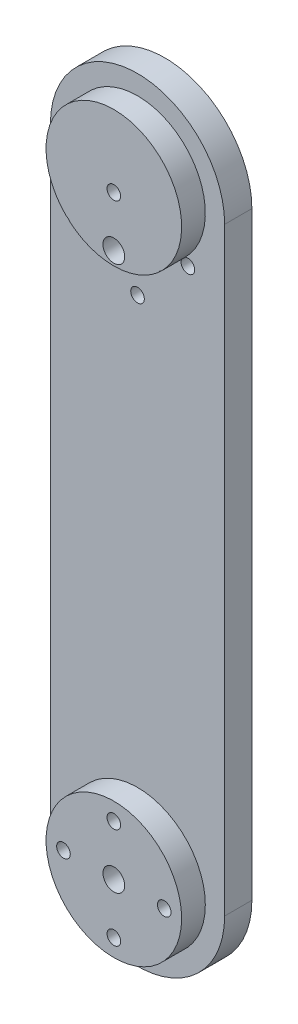
ISO-10303-21;
HEADER;
FILE_DESCRIPTION(('STEP AP214'),'2;1');
FILE_NAME('part.step','',(''),(''),'','','');
FILE_SCHEMA(('AUTOMOTIVE_DESIGN { 1 0 10303 214 1 1 1 1 }'));
ENDSEC;
DATA;
#1=APPLICATION_CONTEXT('core data for automotive mechanical design processes');
#2=APPLICATION_PROTOCOL_DEFINITION('international standard','automotive_design',2000,#1);
#3=PRODUCT_CONTEXT('',#1,'mechanical');
#4=PRODUCT('Part','Part','',(#3));
#5=PRODUCT_RELATED_PRODUCT_CATEGORY('part','',(#4));
#6=PRODUCT_DEFINITION_FORMATION('','',#4);
#7=PRODUCT_DEFINITION_CONTEXT('part definition',#1,'design');
#8=PRODUCT_DEFINITION('design','',#6,#7);
#9=PRODUCT_DEFINITION_SHAPE('','',#8);
#10=(LENGTH_UNIT() NAMED_UNIT(*) SI_UNIT(.MILLI.,.METRE.));
#11=(NAMED_UNIT(*) PLANE_ANGLE_UNIT() SI_UNIT($,.RADIAN.));
#12=(NAMED_UNIT(*) SI_UNIT($,.STERADIAN.) SOLID_ANGLE_UNIT());
#13=UNCERTAINTY_MEASURE_WITH_UNIT(LENGTH_MEASURE(1.E-05),#10,'distance_accuracy_value','');
#14=(GEOMETRIC_REPRESENTATION_CONTEXT(3) GLOBAL_UNCERTAINTY_ASSIGNED_CONTEXT((#13)) GLOBAL_UNIT_ASSIGNED_CONTEXT((#10,
#11,#12)) REPRESENTATION_CONTEXT('',''));
#15=CARTESIAN_POINT('',(0.,0.,0.));
#16=DIRECTION('',(0.,0.,1.));
#17=DIRECTION('',(1.,0.,0.));
#18=AXIS2_PLACEMENT_3D('',#15,#16,#17);
#19=CARTESIAN_POINT('',(0.,220.,79.1278354061801));
#20=DIRECTION('',(0.,0.,-1.));
#21=DIRECTION('',(-1.,0.,0.));
#22=AXIS2_PLACEMENT_3D('',#19,#20,#21);
#23=CYLINDRICAL_SURFACE('',#22,24.9);
#24=CARTESIAN_POINT('',(0.,220.,0.));
#25=DIRECTION('',(0.,0.,-1.));
#26=DIRECTION('',(-1.,0.,0.));
#27=AXIS2_PLACEMENT_3D('',#24,#25,#26);
#28=CIRCLE('',#27,24.9);
#29=CARTESIAN_POINT('',(17.5082287735216,202.294861615507,0.));
#30=VERTEX_POINT('',#29);
#31=CARTESIAN_POINT('',(-17.5082287735216,202.294861615507,0.));
#32=VERTEX_POINT('',#31);
#33=EDGE_CURVE('E163',#30,#32,#28,.F.);
#34=ORIENTED_EDGE('',*,*,#33,.T.);
#35=DIRECTION('',(0.,0.,1.));
#36=VECTOR('',#35,1.);
#37=CARTESIAN_POINT('',(-17.5082287735216,202.294861615507,-0.649994000000001));
#38=LINE('',#37,#36);
#39=CARTESIAN_POINT('',(-17.5082287735216,202.294861615507,8.7));
#40=VERTEX_POINT('',#39);
#41=EDGE_CURVE('E184',#32,#40,#38,.T.);
#42=ORIENTED_EDGE('',*,*,#41,.T.);
#43=CARTESIAN_POINT('',(0.,220.,8.7));
#44=DIRECTION('',(0.,0.,1.));
#45=DIRECTION('',(1.,0.,0.));
#46=AXIS2_PLACEMENT_3D('',#43,#44,#45);
#47=CIRCLE('',#46,24.9);
#48=CARTESIAN_POINT('',(17.5082287735216,202.294861615507,8.7));
#49=VERTEX_POINT('',#48);
#50=EDGE_CURVE('E124',#49,#40,#47,.T.);
#51=ORIENTED_EDGE('',*,*,#50,.F.);
#52=DIRECTION('',(0.,0.,1.));
#53=VECTOR('',#52,1.);
#54=CARTESIAN_POINT('',(17.5082287735216,202.294861615507,-0.649994000000001));
#55=LINE('',#54,#53);
#56=EDGE_CURVE('E57',#49,#30,#55,.F.);
#57=ORIENTED_EDGE('',*,*,#56,.T.);
#58=EDGE_LOOP('',(#34,#42,#51,#57));
#59=FACE_BOUND('',#58,.T.);
#60=ADVANCED_FACE('F41',(#59),#23,.T.);
#61=CARTESIAN_POINT('',(0.,0.,8.7));
#62=DIRECTION('',(0.,0.,-1.));
#63=DIRECTION('',(-1.,0.,0.));
#64=AXIS2_PLACEMENT_3D('',#61,#62,#63);
#65=CYLINDRICAL_SURFACE('',#64,24.9);
#66=CARTESIAN_POINT('',(0.,0.,8.7));
#67=DIRECTION('',(0.,0.,1.));
#68=DIRECTION('',(1.,0.,0.));
#69=AXIS2_PLACEMENT_3D('',#66,#67,#68);
#70=CIRCLE('',#69,24.9);
#71=CARTESIAN_POINT('',(24.9,0.,8.7));
#72=VERTEX_POINT('',#71);
#73=EDGE_CURVE('E160',#72,#72,#70,.T.);
#74=ORIENTED_EDGE('',*,*,#73,.F.);
#75=EDGE_LOOP('',(#74));
#76=FACE_BOUND('',#75,.T.);
#77=CARTESIAN_POINT('',(0.,0.,0.));
#78=DIRECTION('',(0.,0.,1.));
#79=DIRECTION('',(1.,0.,0.));
#80=AXIS2_PLACEMENT_3D('',#77,#78,#79);
#81=CIRCLE('',#80,24.9);
#82=CARTESIAN_POINT('',(24.9,0.,0.));
#83=VERTEX_POINT('',#82);
#84=EDGE_CURVE('E159',#83,#83,#81,.T.);
#85=ORIENTED_EDGE('',*,*,#84,.T.);
#86=EDGE_LOOP('',(#85));
#87=FACE_BOUND('',#86,.T.);
#88=ADVANCED_FACE('F43',(#76,#87),#65,.T.);
#89=CARTESIAN_POINT('',(0.,0.,8.7));
#90=DIRECTION('',(0.,0.,1.));
#91=DIRECTION('',(1.,0.,0.));
#92=AXIS2_PLACEMENT_3D('',#89,#90,#91);
#93=PLANE('',#92);
#94=CARTESIAN_POINT('',(0.,0.,8.7));
#95=DIRECTION('',(0.,0.,1.));
#96=DIRECTION('',(1.,0.,0.));
#97=AXIS2_PLACEMENT_3D('',#94,#95,#96);
#98=CIRCLE('',#97,4.);
#99=CARTESIAN_POINT('',(4.,0.,8.7));
#100=VERTEX_POINT('',#99);
#101=EDGE_CURVE('E129',#100,#100,#98,.T.);
#102=ORIENTED_EDGE('',*,*,#101,.F.);
#103=EDGE_LOOP('',(#102));
#104=FACE_BOUND('',#103,.T.);
#105=CARTESIAN_POINT('',(0.,18.5,8.7));
#106=DIRECTION('',(0.,0.,1.));
#107=DIRECTION('',(1.,0.,0.));
#108=AXIS2_PLACEMENT_3D('',#105,#106,#107);
#109=CIRCLE('',#108,2.5);
#110=CARTESIAN_POINT('',(2.5,18.5,8.7));
#111=VERTEX_POINT('',#110);
#112=EDGE_CURVE('E198',#111,#111,#109,.T.);
#113=ORIENTED_EDGE('',*,*,#112,.F.);
#114=EDGE_LOOP('',(#113));
#115=FACE_BOUND('',#114,.T.);
#116=CARTESIAN_POINT('',(18.5,0.,8.7));
#117=DIRECTION('',(0.,0.,1.));
#118=DIRECTION('',(1.,0.,0.));
#119=AXIS2_PLACEMENT_3D('',#116,#117,#118);
#120=CIRCLE('',#119,2.5);
#121=CARTESIAN_POINT('',(21.,0.,8.7));
#122=VERTEX_POINT('',#121);
#123=EDGE_CURVE('E196',#122,#122,#120,.T.);
#124=ORIENTED_EDGE('',*,*,#123,.F.);
#125=EDGE_LOOP('',(#124));
#126=FACE_BOUND('',#125,.T.);
#127=CARTESIAN_POINT('',(0.,-18.5,8.7));
#128=DIRECTION('',(0.,0.,1.));
#129=DIRECTION('',(1.,0.,0.));
#130=AXIS2_PLACEMENT_3D('',#127,#128,#129);
#131=CIRCLE('',#130,2.5);
#132=CARTESIAN_POINT('',(2.5,-18.5,8.7));
#133=VERTEX_POINT('',#132);
#134=EDGE_CURVE('E193',#133,#133,#131,.T.);
#135=ORIENTED_EDGE('',*,*,#134,.F.);
#136=EDGE_LOOP('',(#135));
#137=FACE_BOUND('',#136,.T.);
#138=CARTESIAN_POINT('',(-18.5,0.,8.7));
#139=DIRECTION('',(0.,0.,1.));
#140=DIRECTION('',(1.,0.,0.));
#141=AXIS2_PLACEMENT_3D('',#138,#139,#140);
#142=CIRCLE('',#141,2.5);
#143=CARTESIAN_POINT('',(-16.,0.,8.7));
#144=VERTEX_POINT('',#143);
#145=EDGE_CURVE('E190',#144,#144,#142,.T.);
#146=ORIENTED_EDGE('',*,*,#145,.F.);
#147=EDGE_LOOP('',(#146));
#148=FACE_BOUND('',#147,.T.);
#149=ORIENTED_EDGE('',*,*,#73,.T.);
#150=EDGE_LOOP('',(#149));
#151=FACE_BOUND('',#150,.T.);
#152=ADVANCED_FACE('F208',(#104,#115,#126,#137,#148,#151),#93,.T.);
#153=CARTESIAN_POINT('',(0.,0.,-10.));
#154=DIRECTION('',(0.,0.,1.));
#155=DIRECTION('',(1.,0.,0.));
#156=AXIS2_PLACEMENT_3D('',#153,#154,#155);
#157=CYLINDRICAL_SURFACE('',#156,32.);
#158=CARTESIAN_POINT('',(0.,0.,0.));
#159=DIRECTION('',(0.,0.,-1.));
#160=DIRECTION('',(-1.,0.,0.));
#161=AXIS2_PLACEMENT_3D('',#158,#159,#160);
#162=CIRCLE('',#161,32.);
#163=CARTESIAN_POINT('',(32.,0.,0.));
#164=VERTEX_POINT('',#163);
#165=CARTESIAN_POINT('',(-32.,0.,0.));
#166=VERTEX_POINT('',#165);
#167=EDGE_CURVE('E123',#164,#166,#162,.T.);
#168=ORIENTED_EDGE('',*,*,#167,.T.);
#169=DIRECTION('',(0.,0.,1.));
#170=VECTOR('',#169,1.);
#171=CARTESIAN_POINT('',(-32.,0.,-10.));
#172=LINE('',#171,#170);
#173=CARTESIAN_POINT('',(-32.,0.,-10.));
#174=VERTEX_POINT('',#173);
#175=EDGE_CURVE('E156',#174,#166,#172,.T.);
#176=ORIENTED_EDGE('',*,*,#175,.F.);
#177=CARTESIAN_POINT('',(0.,0.,-10.));
#178=DIRECTION('',(0.,0.,-1.));
#179=DIRECTION('',(-1.,0.,0.));
#180=AXIS2_PLACEMENT_3D('',#177,#178,#179);
#181=CIRCLE('',#180,32.);
#182=CARTESIAN_POINT('',(32.,0.,-10.));
#183=VERTEX_POINT('',#182);
#184=EDGE_CURVE('E133',#183,#174,#181,.T.);
#185=ORIENTED_EDGE('',*,*,#184,.F.);
#186=DIRECTION('',(0.,0.,1.));
#187=VECTOR('',#186,1.);
#188=CARTESIAN_POINT('',(32.,0.,-10.));
#189=LINE('',#188,#187);
#190=EDGE_CURVE('E142',#183,#164,#189,.T.);
#191=ORIENTED_EDGE('',*,*,#190,.T.);
#192=EDGE_LOOP('',(#168,#176,#185,#191));
#193=FACE_BOUND('',#192,.T.);
#194=ADVANCED_FACE('F211',(#193),#157,.T.);
#195=CARTESIAN_POINT('',(-32.,0.,-10.));
#196=DIRECTION('',(1.,0.,0.));
#197=DIRECTION('',(0.,0.,-1.));
#198=AXIS2_PLACEMENT_3D('',#195,#196,#197);
#199=PLANE('',#198);
#200=DIRECTION('',(0.,1.,0.));
#201=VECTOR('',#200,1.);
#202=CARTESIAN_POINT('',(-32.,0.,0.));
#203=LINE('',#202,#201);
#204=CARTESIAN_POINT('',(-32.,220.,0.));
#205=VERTEX_POINT('',#204);
#206=EDGE_CURVE('E127',#166,#205,#203,.T.);
#207=ORIENTED_EDGE('',*,*,#206,.T.);
#208=DIRECTION('',(0.,0.,1.));
#209=VECTOR('',#208,1.);
#210=CARTESIAN_POINT('',(-32.,220.,-10.));
#211=LINE('',#210,#209);
#212=CARTESIAN_POINT('',(-32.,220.,-10.));
#213=VERTEX_POINT('',#212);
#214=EDGE_CURVE('E153',#213,#205,#211,.T.);
#215=ORIENTED_EDGE('',*,*,#214,.F.);
#216=DIRECTION('',(0.,1.,0.));
#217=VECTOR('',#216,1.);
#218=CARTESIAN_POINT('',(-32.,0.,-10.));
#219=LINE('',#218,#217);
#220=EDGE_CURVE('E136',#174,#213,#219,.T.);
#221=ORIENTED_EDGE('',*,*,#220,.F.);
#222=ORIENTED_EDGE('',*,*,#175,.T.);
#223=EDGE_LOOP('',(#207,#215,#221,#222));
#224=FACE_BOUND('',#223,.T.);
#225=ADVANCED_FACE('F247',(#224),#199,.F.);
#226=CARTESIAN_POINT('',(0.,220.,-10.));
#227=DIRECTION('',(0.,0.,1.));
#228=DIRECTION('',(1.,0.,0.));
#229=AXIS2_PLACEMENT_3D('',#226,#227,#228);
#230=CYLINDRICAL_SURFACE('',#229,32.);
#231=CARTESIAN_POINT('',(0.,220.,0.));
#232=DIRECTION('',(0.,0.,-1.));
#233=DIRECTION('',(-1.,0.,0.));
#234=AXIS2_PLACEMENT_3D('',#231,#232,#233);
#235=CIRCLE('',#234,32.);
#236=CARTESIAN_POINT('',(32.,220.,0.));
#237=VERTEX_POINT('',#236);
#238=EDGE_CURVE('E145',#205,#237,#235,.T.);
#239=ORIENTED_EDGE('',*,*,#238,.T.);
#240=DIRECTION('',(0.,0.,1.));
#241=VECTOR('',#240,1.);
#242=CARTESIAN_POINT('',(32.,220.,-10.));
#243=LINE('',#242,#241);
#244=CARTESIAN_POINT('',(32.,220.,-10.));
#245=VERTEX_POINT('',#244);
#246=EDGE_CURVE('E150',#245,#237,#243,.T.);
#247=ORIENTED_EDGE('',*,*,#246,.F.);
#248=CARTESIAN_POINT('',(0.,220.,-10.));
#249=DIRECTION('',(0.,0.,-1.));
#250=DIRECTION('',(-1.,0.,0.));
#251=AXIS2_PLACEMENT_3D('',#248,#249,#250);
#252=CIRCLE('',#251,32.);
#253=EDGE_CURVE('E139',#213,#245,#252,.T.);
#254=ORIENTED_EDGE('',*,*,#253,.F.);
#255=ORIENTED_EDGE('',*,*,#214,.T.);
#256=EDGE_LOOP('',(#239,#247,#254,#255));
#257=FACE_BOUND('',#256,.T.);
#258=ADVANCED_FACE('F244',(#257),#230,.T.);
#259=CARTESIAN_POINT('',(32.,0.,-10.));
#260=DIRECTION('',(-1.,0.,0.));
#261=DIRECTION('',(0.,0.,1.));
#262=AXIS2_PLACEMENT_3D('',#259,#260,#261);
#263=PLANE('',#262);
#264=DIRECTION('',(0.,-1.,0.));
#265=VECTOR('',#264,1.);
#266=CARTESIAN_POINT('',(32.,0.,0.));
#267=LINE('',#266,#265);
#268=EDGE_CURVE('E137',#237,#164,#267,.T.);
#269=ORIENTED_EDGE('',*,*,#268,.T.);
#270=ORIENTED_EDGE('',*,*,#190,.F.);
#271=DIRECTION('',(0.,-1.,0.));
#272=VECTOR('',#271,1.);
#273=CARTESIAN_POINT('',(32.,0.,-10.));
#274=LINE('',#273,#272);
#275=EDGE_CURVE('E141',#245,#183,#274,.T.);
#276=ORIENTED_EDGE('',*,*,#275,.F.);
#277=ORIENTED_EDGE('',*,*,#246,.T.);
#278=EDGE_LOOP('',(#269,#270,#276,#277));
#279=FACE_BOUND('',#278,.T.);
#280=ADVANCED_FACE('F240',(#279),#263,.F.);
#281=CARTESIAN_POINT('',(0.,0.,-10.));
#282=DIRECTION('',(0.,0.,-1.));
#283=DIRECTION('',(-1.,0.,0.));
#284=AXIS2_PLACEMENT_3D('',#281,#282,#283);
#285=PLANE('',#284);
#286=CARTESIAN_POINT('',(-18.5,200.,-10.));
#287=DIRECTION('',(0.,0.,1.));
#288=DIRECTION('',(1.,0.,0.));
#289=AXIS2_PLACEMENT_3D('',#286,#287,#288);
#290=CIRCLE('',#289,2.5);
#291=CARTESIAN_POINT('',(-16.,200.,-10.));
#292=VERTEX_POINT('',#291);
#293=EDGE_CURVE('E329',#292,#292,#290,.T.);
#294=ORIENTED_EDGE('',*,*,#293,.T.);
#295=EDGE_LOOP('',(#294));
#296=FACE_BOUND('',#295,.T.);
#297=CARTESIAN_POINT('',(0.,181.5,-10.));
#298=DIRECTION('',(0.,0.,1.));
#299=DIRECTION('',(1.,0.,0.));
#300=AXIS2_PLACEMENT_3D('',#297,#298,#299);
#301=CIRCLE('',#300,2.50000000000001);
#302=CARTESIAN_POINT('',(2.50000000000001,181.5,-10.));
#303=VERTEX_POINT('',#302);
#304=EDGE_CURVE('E323',#303,#303,#301,.T.);
#305=ORIENTED_EDGE('',*,*,#304,.T.);
#306=EDGE_LOOP('',(#305));
#307=FACE_BOUND('',#306,.T.);
#308=CARTESIAN_POINT('',(18.5,200.,-10.));
#309=DIRECTION('',(0.,0.,1.));
#310=DIRECTION('',(1.,0.,0.));
#311=AXIS2_PLACEMENT_3D('',#308,#309,#310);
#312=CIRCLE('',#311,2.5);
#313=CARTESIAN_POINT('',(21.,200.,-10.));
#314=VERTEX_POINT('',#313);
#315=EDGE_CURVE('E334',#314,#314,#312,.T.);
#316=ORIENTED_EDGE('',*,*,#315,.T.);
#317=EDGE_LOOP('',(#316));
#318=FACE_BOUND('',#317,.T.);
#319=CARTESIAN_POINT('',(0.,0.,-10.));
#320=DIRECTION('',(0.,0.,1.));
#321=DIRECTION('',(1.,0.,0.));
#322=AXIS2_PLACEMENT_3D('',#319,#320,#321);
#323=CIRCLE('',#322,4.);
#324=CARTESIAN_POINT('',(4.,0.,-10.));
#325=VERTEX_POINT('',#324);
#326=EDGE_CURVE('E336',#325,#325,#323,.T.);
#327=ORIENTED_EDGE('',*,*,#326,.T.);
#328=EDGE_LOOP('',(#327));
#329=FACE_BOUND('',#328,.T.);
#330=CARTESIAN_POINT('',(0.,218.5,-10.));
#331=DIRECTION('',(0.,0.,1.));
#332=DIRECTION('',(1.,0.,0.));
#333=AXIS2_PLACEMENT_3D('',#330,#331,#332);
#334=CIRCLE('',#333,2.50000000000001);
#335=CARTESIAN_POINT('',(2.50000000000001,218.5,-10.));
#336=VERTEX_POINT('',#335);
#337=EDGE_CURVE('E327',#336,#336,#334,.T.);
#338=ORIENTED_EDGE('',*,*,#337,.T.);
#339=EDGE_LOOP('',(#338));
#340=FACE_BOUND('',#339,.T.);
#341=CARTESIAN_POINT('',(0.,18.5,-10.));
#342=DIRECTION('',(0.,0.,1.));
#343=DIRECTION('',(1.,0.,0.));
#344=AXIS2_PLACEMENT_3D('',#341,#342,#343);
#345=CIRCLE('',#344,2.5);
#346=CARTESIAN_POINT('',(2.5,18.5,-10.));
#347=VERTEX_POINT('',#346);
#348=EDGE_CURVE('E320',#347,#347,#345,.T.);
#349=ORIENTED_EDGE('',*,*,#348,.T.);
#350=EDGE_LOOP('',(#349));
#351=FACE_BOUND('',#350,.T.);
#352=CARTESIAN_POINT('',(18.5,0.,-10.));
#353=DIRECTION('',(0.,0.,1.));
#354=DIRECTION('',(1.,0.,0.));
#355=AXIS2_PLACEMENT_3D('',#352,#353,#354);
#356=CIRCLE('',#355,2.5);
#357=CARTESIAN_POINT('',(21.,0.,-10.));
#358=VERTEX_POINT('',#357);
#359=EDGE_CURVE('E315',#358,#358,#356,.T.);
#360=ORIENTED_EDGE('',*,*,#359,.T.);
#361=EDGE_LOOP('',(#360));
#362=FACE_BOUND('',#361,.T.);
#363=CARTESIAN_POINT('',(0.,-18.5,-10.));
#364=DIRECTION('',(0.,0.,1.));
#365=DIRECTION('',(1.,0.,0.));
#366=AXIS2_PLACEMENT_3D('',#363,#364,#365);
#367=CIRCLE('',#366,2.5);
#368=CARTESIAN_POINT('',(2.5,-18.5,-10.));
#369=VERTEX_POINT('',#368);
#370=EDGE_CURVE('E313',#369,#369,#367,.T.);
#371=ORIENTED_EDGE('',*,*,#370,.T.);
#372=EDGE_LOOP('',(#371));
#373=FACE_BOUND('',#372,.T.);
#374=CARTESIAN_POINT('',(0.,200.,-10.));
#375=DIRECTION('',(0.,0.,1.));
#376=DIRECTION('',(1.,0.,0.));
#377=AXIS2_PLACEMENT_3D('',#374,#375,#376);
#378=CIRCLE('',#377,4.00000000000001);
#379=CARTESIAN_POINT('',(4.00000000000001,200.,-10.));
#380=VERTEX_POINT('',#379);
#381=EDGE_CURVE('E339',#380,#380,#378,.T.);
#382=ORIENTED_EDGE('',*,*,#381,.T.);
#383=EDGE_LOOP('',(#382));
#384=FACE_BOUND('',#383,.T.);
#385=CARTESIAN_POINT('',(-18.5,0.,-10.));
#386=DIRECTION('',(0.,0.,1.));
#387=DIRECTION('',(1.,0.,0.));
#388=AXIS2_PLACEMENT_3D('',#385,#386,#387);
#389=CIRCLE('',#388,2.5);
#390=CARTESIAN_POINT('',(-16.,0.,-10.));
#391=VERTEX_POINT('',#390);
#392=EDGE_CURVE('E172',#391,#391,#389,.T.);
#393=ORIENTED_EDGE('',*,*,#392,.T.);
#394=EDGE_LOOP('',(#393));
#395=FACE_BOUND('',#394,.T.);
#396=ORIENTED_EDGE('',*,*,#184,.T.);
#397=ORIENTED_EDGE('',*,*,#220,.T.);
#398=ORIENTED_EDGE('',*,*,#253,.T.);
#399=ORIENTED_EDGE('',*,*,#275,.T.);
#400=EDGE_LOOP('',(#396,#397,#398,#399));
#401=FACE_BOUND('',#400,.T.);
#402=ADVANCED_FACE('F228',(#296,#307,#318,#329,#340,#351,#362,#373,#384,#395,#401),#285,.T.);
#403=CARTESIAN_POINT('',(0.,0.,0.));
#404=DIRECTION('',(0.,0.,-1.));
#405=DIRECTION('',(-1.,0.,0.));
#406=AXIS2_PLACEMENT_3D('',#403,#404,#405);
#407=PLANE('',#406);
#408=CARTESIAN_POINT('',(0.,181.5,0.));
#409=DIRECTION('',(0.,0.,-1.));
#410=DIRECTION('',(-1.,0.,0.));
#411=AXIS2_PLACEMENT_3D('',#408,#409,#410);
#412=CIRCLE('',#411,2.50000000000001);
#413=CARTESIAN_POINT('',(-2.50000000000001,181.5,0.));
#414=VERTEX_POINT('',#413);
#415=EDGE_CURVE('E45',#414,#414,#412,.T.);
#416=ORIENTED_EDGE('',*,*,#415,.T.);
#417=EDGE_LOOP('',(#416));
#418=FACE_BOUND('',#417,.T.);
#419=CARTESIAN_POINT('',(-16.2892585959631,201.167314201266,0.));
#420=VERTEX_POINT('',#419);
#421=CARTESIAN_POINT('',(16.2892585959631,201.167314201266,0.));
#422=VERTEX_POINT('',#421);
#423=EDGE_CURVE('E111',#420,#422,#28,.F.);
#424=ORIENTED_EDGE('',*,*,#423,.F.);
#425=CARTESIAN_POINT('',(-18.5,200.,0.));
#426=DIRECTION('',(0.,0.,-1.));
#427=DIRECTION('',(-1.,0.,0.));
#428=AXIS2_PLACEMENT_3D('',#425,#426,#427);
#429=CIRCLE('',#428,2.5);
#430=EDGE_CURVE('E187',#420,#32,#429,.T.);
#431=ORIENTED_EDGE('',*,*,#430,.T.);
#432=ORIENTED_EDGE('',*,*,#33,.F.);
#433=CARTESIAN_POINT('',(18.5,200.,0.));
#434=DIRECTION('',(0.,0.,-1.));
#435=DIRECTION('',(-1.,0.,0.));
#436=AXIS2_PLACEMENT_3D('',#433,#434,#435);
#437=CIRCLE('',#436,2.5);
#438=EDGE_CURVE('E119',#30,#422,#437,.T.);
#439=ORIENTED_EDGE('',*,*,#438,.T.);
#440=EDGE_LOOP('',(#424,#431,#432,#439));
#441=FACE_BOUND('',#440,.T.);
#442=ORIENTED_EDGE('',*,*,#84,.F.);
#443=EDGE_LOOP('',(#442));
#444=FACE_BOUND('',#443,.T.);
#445=ORIENTED_EDGE('',*,*,#167,.F.);
#446=ORIENTED_EDGE('',*,*,#268,.F.);
#447=ORIENTED_EDGE('',*,*,#238,.F.);
#448=ORIENTED_EDGE('',*,*,#206,.F.);
#449=EDGE_LOOP('',(#445,#446,#447,#448));
#450=FACE_BOUND('',#449,.T.);
#451=ADVANCED_FACE('F225',(#418,#441,#444,#450),#407,.F.);
#452=CARTESIAN_POINT('',(-16.2892585959631,201.167314201266,8.7));
#453=VERTEX_POINT('',#452);
#454=CARTESIAN_POINT('',(16.2892585959631,201.167314201266,8.7));
#455=VERTEX_POINT('',#454);
#456=EDGE_CURVE('E117',#453,#455,#47,.T.);
#457=ORIENTED_EDGE('',*,*,#456,.F.);
#458=DIRECTION('',(0.,0.,1.));
#459=VECTOR('',#458,1.);
#460=CARTESIAN_POINT('',(-16.2892585959631,201.167314201266,-0.649994000000001));
#461=LINE('',#460,#459);
#462=EDGE_CURVE('E64',#453,#420,#461,.F.);
#463=ORIENTED_EDGE('',*,*,#462,.T.);
#464=ORIENTED_EDGE('',*,*,#423,.T.);
#465=DIRECTION('',(0.,0.,1.));
#466=VECTOR('',#465,1.);
#467=CARTESIAN_POINT('',(16.2892585959631,201.167314201266,-0.649994000000001));
#468=LINE('',#467,#466);
#469=EDGE_CURVE('E105',#422,#455,#468,.T.);
#470=ORIENTED_EDGE('',*,*,#469,.T.);
#471=EDGE_LOOP('',(#457,#463,#464,#470));
#472=FACE_BOUND('',#471,.T.);
#473=ADVANCED_FACE('F116',(#472),#23,.T.);
#474=CARTESIAN_POINT('',(0.,0.,8.7));
#475=DIRECTION('',(0.,0.,1.));
#476=DIRECTION('',(1.,0.,0.));
#477=AXIS2_PLACEMENT_3D('',#474,#475,#476);
#478=PLANE('',#477);
#479=CARTESIAN_POINT('',(-18.5,200.,8.7));
#480=DIRECTION('',(0.,0.,1.));
#481=DIRECTION('',(1.,0.,0.));
#482=AXIS2_PLACEMENT_3D('',#479,#480,#481);
#483=CIRCLE('',#482,2.5);
#484=EDGE_CURVE('E11',#453,#40,#483,.T.);
#485=ORIENTED_EDGE('',*,*,#484,.F.);
#486=ORIENTED_EDGE('',*,*,#456,.T.);
#487=CARTESIAN_POINT('',(18.5,200.,8.7));
#488=DIRECTION('',(0.,0.,1.));
#489=DIRECTION('',(1.,0.,0.));
#490=AXIS2_PLACEMENT_3D('',#487,#488,#489);
#491=CIRCLE('',#490,2.5);
#492=EDGE_CURVE('E50',#49,#455,#491,.T.);
#493=ORIENTED_EDGE('',*,*,#492,.F.);
#494=ORIENTED_EDGE('',*,*,#50,.T.);
#495=EDGE_LOOP('',(#485,#486,#493,#494));
#496=FACE_BOUND('',#495,.T.);
#497=CARTESIAN_POINT('',(0.,218.5,8.7));
#498=DIRECTION('',(0.,0.,1.));
#499=DIRECTION('',(1.,0.,0.));
#500=AXIS2_PLACEMENT_3D('',#497,#498,#499);
#501=CIRCLE('',#500,2.50000000000001);
#502=CARTESIAN_POINT('',(2.50000000000001,218.5,8.7));
#503=VERTEX_POINT('',#502);
#504=EDGE_CURVE('E171',#503,#503,#501,.T.);
#505=ORIENTED_EDGE('',*,*,#504,.F.);
#506=EDGE_LOOP('',(#505));
#507=FACE_BOUND('',#506,.T.);
#508=CARTESIAN_POINT('',(0.,200.,8.7));
#509=DIRECTION('',(0.,0.,1.));
#510=DIRECTION('',(1.,0.,0.));
#511=AXIS2_PLACEMENT_3D('',#508,#509,#510);
#512=CIRCLE('',#511,4.00000000000001);
#513=CARTESIAN_POINT('',(4.00000000000001,200.,8.7));
#514=VERTEX_POINT('',#513);
#515=EDGE_CURVE('E168',#514,#514,#512,.T.);
#516=ORIENTED_EDGE('',*,*,#515,.F.);
#517=EDGE_LOOP('',(#516));
#518=FACE_BOUND('',#517,.T.);
#519=ADVANCED_FACE('F121',(#496,#507,#518),#478,.T.);
#520=CARTESIAN_POINT('',(0.,200.,-10.));
#521=DIRECTION('',(0.,0.,1.));
#522=DIRECTION('',(1.,0.,0.));
#523=AXIS2_PLACEMENT_3D('',#520,#521,#522);
#524=CYLINDRICAL_SURFACE('',#523,4.00000000000001);
#525=ORIENTED_EDGE('',*,*,#515,.T.);
#526=EDGE_LOOP('',(#525));
#527=FACE_BOUND('',#526,.T.);
#528=ORIENTED_EDGE('',*,*,#381,.F.);
#529=EDGE_LOOP('',(#528));
#530=FACE_BOUND('',#529,.T.);
#531=ADVANCED_FACE('F268',(#527,#530),#524,.F.);
#532=CARTESIAN_POINT('',(0.,218.5,-10.));
#533=DIRECTION('',(0.,0.,1.));
#534=DIRECTION('',(1.,0.,0.));
#535=AXIS2_PLACEMENT_3D('',#532,#533,#534);
#536=CYLINDRICAL_SURFACE('',#535,2.50000000000001);
#537=ORIENTED_EDGE('',*,*,#504,.T.);
#538=EDGE_LOOP('',(#537));
#539=FACE_BOUND('',#538,.T.);
#540=ORIENTED_EDGE('',*,*,#337,.F.);
#541=EDGE_LOOP('',(#540));
#542=FACE_BOUND('',#541,.T.);
#543=ADVANCED_FACE('F272',(#539,#542),#536,.F.);
#544=CARTESIAN_POINT('',(18.5,200.,-10.));
#545=DIRECTION('',(0.,0.,1.));
#546=DIRECTION('',(1.,0.,0.));
#547=AXIS2_PLACEMENT_3D('',#544,#545,#546);
#548=CYLINDRICAL_SURFACE('',#547,2.5);
#549=ORIENTED_EDGE('',*,*,#315,.F.);
#550=EDGE_LOOP('',(#549));
#551=FACE_BOUND('',#550,.T.);
#552=ORIENTED_EDGE('',*,*,#56,.F.);
#553=ORIENTED_EDGE('',*,*,#492,.T.);
#554=ORIENTED_EDGE('',*,*,#469,.F.);
#555=ORIENTED_EDGE('',*,*,#438,.F.);
#556=EDGE_LOOP('',(#552,#553,#554,#555));
#557=FACE_BOUND('',#556,.T.);
#558=ADVANCED_FACE('F104',(#551,#557),#548,.F.);
#559=CARTESIAN_POINT('',(-18.5,200.,-10.));
#560=DIRECTION('',(0.,0.,1.));
#561=DIRECTION('',(1.,0.,0.));
#562=AXIS2_PLACEMENT_3D('',#559,#560,#561);
#563=CYLINDRICAL_SURFACE('',#562,2.5);
#564=ORIENTED_EDGE('',*,*,#293,.F.);
#565=EDGE_LOOP('',(#564));
#566=FACE_BOUND('',#565,.T.);
#567=ORIENTED_EDGE('',*,*,#462,.F.);
#568=ORIENTED_EDGE('',*,*,#484,.T.);
#569=ORIENTED_EDGE('',*,*,#41,.F.);
#570=ORIENTED_EDGE('',*,*,#430,.F.);
#571=EDGE_LOOP('',(#567,#568,#569,#570));
#572=FACE_BOUND('',#571,.T.);
#573=ADVANCED_FACE('F283',(#566,#572),#563,.F.);
#574=CARTESIAN_POINT('',(0.,181.5,-10.));
#575=DIRECTION('',(0.,0.,1.));
#576=DIRECTION('',(1.,0.,0.));
#577=AXIS2_PLACEMENT_3D('',#574,#575,#576);
#578=CYLINDRICAL_SURFACE('',#577,2.50000000000001);
#579=ORIENTED_EDGE('',*,*,#304,.F.);
#580=EDGE_LOOP('',(#579));
#581=FACE_BOUND('',#580,.T.);
#582=ORIENTED_EDGE('',*,*,#415,.F.);
#583=EDGE_LOOP('',(#582));
#584=FACE_BOUND('',#583,.T.);
#585=ADVANCED_FACE('F290',(#581,#584),#578,.F.);
#586=CARTESIAN_POINT('',(-18.5,0.,-10.));
#587=DIRECTION('',(0.,0.,1.));
#588=DIRECTION('',(1.,0.,0.));
#589=AXIS2_PLACEMENT_3D('',#586,#587,#588);
#590=CYLINDRICAL_SURFACE('',#589,2.5);
#591=ORIENTED_EDGE('',*,*,#145,.T.);
#592=EDGE_LOOP('',(#591));
#593=FACE_BOUND('',#592,.T.);
#594=ORIENTED_EDGE('',*,*,#392,.F.);
#595=EDGE_LOOP('',(#594));
#596=FACE_BOUND('',#595,.T.);
#597=ADVANCED_FACE('F294',(#593,#596),#590,.F.);
#598=CARTESIAN_POINT('',(0.,-18.5,-10.));
#599=DIRECTION('',(0.,0.,1.));
#600=DIRECTION('',(1.,0.,0.));
#601=AXIS2_PLACEMENT_3D('',#598,#599,#600);
#602=CYLINDRICAL_SURFACE('',#601,2.5);
#603=ORIENTED_EDGE('',*,*,#134,.T.);
#604=EDGE_LOOP('',(#603));
#605=FACE_BOUND('',#604,.T.);
#606=ORIENTED_EDGE('',*,*,#370,.F.);
#607=EDGE_LOOP('',(#606));
#608=FACE_BOUND('',#607,.T.);
#609=ADVANCED_FACE('F296',(#605,#608),#602,.F.);
#610=CARTESIAN_POINT('',(18.5,0.,-10.));
#611=DIRECTION('',(0.,0.,1.));
#612=DIRECTION('',(1.,0.,0.));
#613=AXIS2_PLACEMENT_3D('',#610,#611,#612);
#614=CYLINDRICAL_SURFACE('',#613,2.5);
#615=ORIENTED_EDGE('',*,*,#123,.T.);
#616=EDGE_LOOP('',(#615));
#617=FACE_BOUND('',#616,.T.);
#618=ORIENTED_EDGE('',*,*,#359,.F.);
#619=EDGE_LOOP('',(#618));
#620=FACE_BOUND('',#619,.T.);
#621=ADVANCED_FACE('F299',(#617,#620),#614,.F.);
#622=CARTESIAN_POINT('',(0.,18.5,-10.));
#623=DIRECTION('',(0.,0.,1.));
#624=DIRECTION('',(1.,0.,0.));
#625=AXIS2_PLACEMENT_3D('',#622,#623,#624);
#626=CYLINDRICAL_SURFACE('',#625,2.5);
#627=ORIENTED_EDGE('',*,*,#112,.T.);
#628=EDGE_LOOP('',(#627));
#629=FACE_BOUND('',#628,.T.);
#630=ORIENTED_EDGE('',*,*,#348,.F.);
#631=EDGE_LOOP('',(#630));
#632=FACE_BOUND('',#631,.T.);
#633=ADVANCED_FACE('F287',(#629,#632),#626,.F.);
#634=CARTESIAN_POINT('',(0.,0.,-10.));
#635=DIRECTION('',(0.,0.,1.));
#636=DIRECTION('',(1.,0.,0.));
#637=AXIS2_PLACEMENT_3D('',#634,#635,#636);
#638=CYLINDRICAL_SURFACE('',#637,4.);
#639=ORIENTED_EDGE('',*,*,#101,.T.);
#640=EDGE_LOOP('',(#639));
#641=FACE_BOUND('',#640,.T.);
#642=ORIENTED_EDGE('',*,*,#326,.F.);
#643=EDGE_LOOP('',(#642));
#644=FACE_BOUND('',#643,.T.);
#645=ADVANCED_FACE('F205',(#641,#644),#638,.F.);
#646=CLOSED_SHELL('',(#60,#88,#152,#194,#225,#258,#280,#402,#451,#473,#519,#531,#543,#558,#573,
#585,#597,#609,#621,#633,#645));
#647=MANIFOLD_SOLID_BREP('B2',#646);
#648=ADVANCED_BREP_SHAPE_REPRESENTATION('',(#18,#647),#14);
#649=SHAPE_DEFINITION_REPRESENTATION(#9,#648);
ENDSEC;
END-ISO-10303-21;
